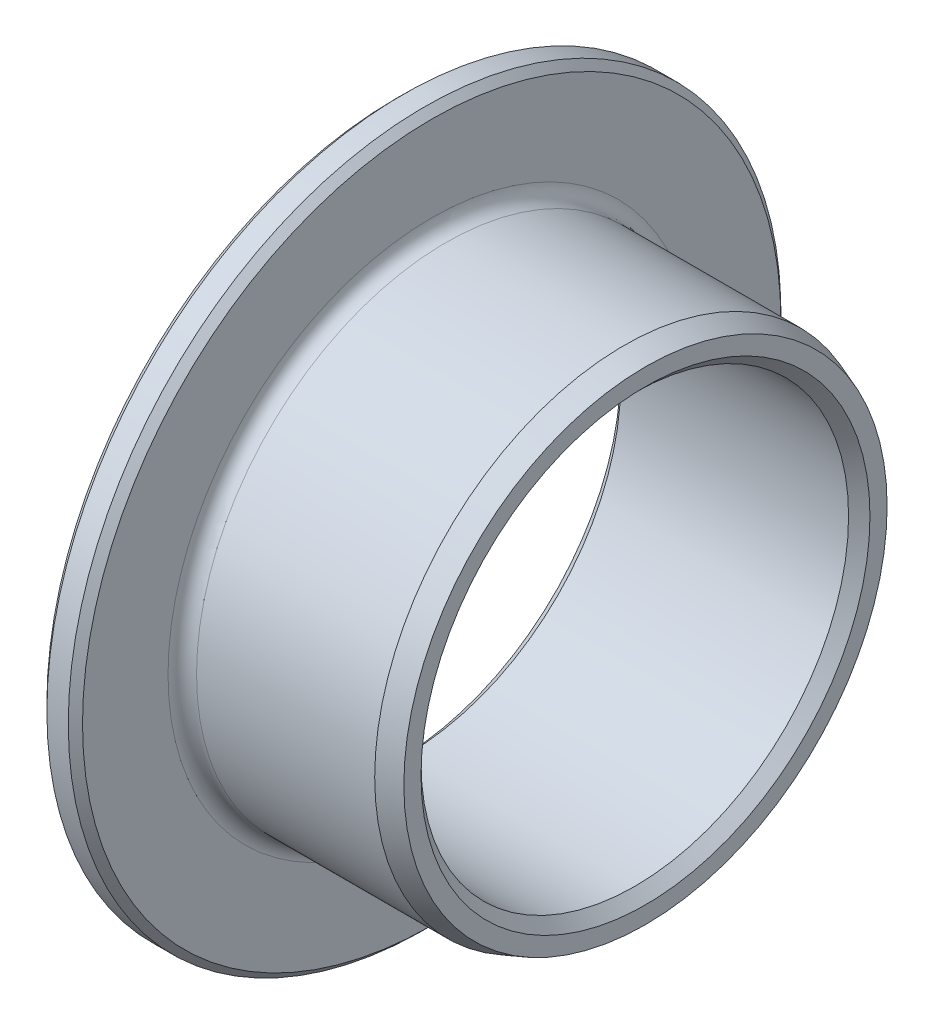
ISO-10303-21;
HEADER;
FILE_DESCRIPTION(('STEP AP214'),'2;1');
FILE_NAME('part.step','',(''),(''),'','','');
FILE_SCHEMA(('AUTOMOTIVE_DESIGN { 1 0 10303 214 1 1 1 1 }'));
ENDSEC;
DATA;
#1=APPLICATION_CONTEXT('core data for automotive mechanical design processes');
#2=APPLICATION_PROTOCOL_DEFINITION('international standard','automotive_design',2000,#1);
#3=PRODUCT_CONTEXT('',#1,'mechanical');
#4=PRODUCT('Part','Part','',(#3));
#5=PRODUCT_RELATED_PRODUCT_CATEGORY('part','',(#4));
#6=PRODUCT_DEFINITION_FORMATION('','',#4);
#7=PRODUCT_DEFINITION_CONTEXT('part definition',#1,'design');
#8=PRODUCT_DEFINITION('design','',#6,#7);
#9=PRODUCT_DEFINITION_SHAPE('','',#8);
#10=(LENGTH_UNIT() NAMED_UNIT(*) SI_UNIT(.MILLI.,.METRE.));
#11=(NAMED_UNIT(*) PLANE_ANGLE_UNIT() SI_UNIT($,.RADIAN.));
#12=(NAMED_UNIT(*) SI_UNIT($,.STERADIAN.) SOLID_ANGLE_UNIT());
#13=UNCERTAINTY_MEASURE_WITH_UNIT(LENGTH_MEASURE(1.E-05),#10,'distance_accuracy_value','');
#14=(GEOMETRIC_REPRESENTATION_CONTEXT(3) GLOBAL_UNCERTAINTY_ASSIGNED_CONTEXT((#13)) GLOBAL_UNIT_ASSIGNED_CONTEXT((#10,
#11,#12)) REPRESENTATION_CONTEXT('',''));
#15=CARTESIAN_POINT('',(0.,0.,0.));
#16=DIRECTION('',(0.,0.,1.));
#17=DIRECTION('',(1.,0.,0.));
#18=AXIS2_PLACEMENT_3D('',#15,#16,#17);
#19=CARTESIAN_POINT('',(0.,10.,0.));
#20=DIRECTION('',(-1.,0.,0.));
#21=DIRECTION('',(0.,0.,1.));
#22=AXIS2_PLACEMENT_3D('',#19,#20,#21);
#23=PLANE('',#22);
#24=CARTESIAN_POINT('',(0.,0.,0.));
#25=DIRECTION('',(-1.,0.,0.));
#26=DIRECTION('',(0.,0.,1.));
#27=AXIS2_PLACEMENT_3D('',#24,#25,#26);
#28=CIRCLE('',#27,7.4);
#29=CARTESIAN_POINT('',(0.,0.,7.4));
#30=VERTEX_POINT('',#29);
#31=EDGE_CURVE('E38',#30,#30,#28,.T.);
#32=ORIENTED_EDGE('',*,*,#31,.T.);
#33=EDGE_LOOP('',(#32));
#34=FACE_BOUND('',#33,.T.);
#35=CARTESIAN_POINT('',(0.,0.,0.));
#36=DIRECTION('',(-1.,0.,0.));
#37=DIRECTION('',(0.,0.,1.));
#38=AXIS2_PLACEMENT_3D('',#35,#36,#37);
#39=CIRCLE('',#38,9.8);
#40=CARTESIAN_POINT('',(0.,0.,9.8));
#41=VERTEX_POINT('',#40);
#42=EDGE_CURVE('E42',#41,#41,#39,.F.);
#43=ORIENTED_EDGE('',*,*,#42,.T.);
#44=EDGE_LOOP('',(#43));
#45=FACE_BOUND('',#44,.T.);
#46=ADVANCED_FACE('F32',(#34,#45),#23,.F.);
#47=CARTESIAN_POINT('',(-5.31268266176283,0.,0.));
#48=DIRECTION('',(-1.,0.,0.));
#49=DIRECTION('',(0.,0.,1.));
#50=AXIS2_PLACEMENT_3D('',#47,#48,#49);
#51=CYLINDRICAL_SURFACE('',#50,7.);
#52=CARTESIAN_POINT('',(0.400000000000002,0.,0.));
#53=DIRECTION('',(-1.,0.,0.));
#54=DIRECTION('',(0.,0.,1.));
#55=AXIS2_PLACEMENT_3D('',#52,#53,#54);
#56=CIRCLE('',#55,7.);
#57=CARTESIAN_POINT('',(0.400000000000002,0.,7.));
#58=VERTEX_POINT('',#57);
#59=EDGE_CURVE('E10',#58,#58,#56,.F.);
#60=ORIENTED_EDGE('',*,*,#59,.T.);
#61=EDGE_LOOP('',(#60));
#62=FACE_BOUND('',#61,.T.);
#63=CARTESIAN_POINT('',(5.4,0.,0.));
#64=DIRECTION('',(-1.,0.,0.));
#65=DIRECTION('',(0.,0.,1.));
#66=AXIS2_PLACEMENT_3D('',#63,#64,#65);
#67=CIRCLE('',#66,7.);
#68=CARTESIAN_POINT('',(5.4,0.,7.));
#69=VERTEX_POINT('',#68);
#70=EDGE_CURVE('E73',#69,#69,#67,.T.);
#71=ORIENTED_EDGE('',*,*,#70,.T.);
#72=EDGE_LOOP('',(#71));
#73=FACE_BOUND('',#72,.T.);
#74=ADVANCED_FACE('F77',(#62,#73),#51,.T.);
#75=CARTESIAN_POINT('',(6.,7.,0.));
#76=DIRECTION('',(-1.,0.,0.));
#77=DIRECTION('',(0.,0.,1.));
#78=AXIS2_PLACEMENT_3D('',#75,#76,#77);
#79=PLANE('',#78);
#80=CARTESIAN_POINT('',(6.,0.,0.));
#81=DIRECTION('',(-1.,0.,0.));
#82=DIRECTION('',(0.,0.,1.));
#83=AXIS2_PLACEMENT_3D('',#80,#81,#82);
#84=CIRCLE('',#83,6.3);
#85=CARTESIAN_POINT('',(6.,0.,6.3));
#86=VERTEX_POINT('',#85);
#87=EDGE_CURVE('E57',#86,#86,#84,.T.);
#88=ORIENTED_EDGE('',*,*,#87,.T.);
#89=EDGE_LOOP('',(#88));
#90=FACE_BOUND('',#89,.T.);
#91=CARTESIAN_POINT('',(6.,0.,0.));
#92=DIRECTION('',(-1.,0.,0.));
#93=DIRECTION('',(0.,0.,1.));
#94=AXIS2_PLACEMENT_3D('',#91,#92,#93);
#95=CIRCLE('',#94,6.78161785944028);
#96=CARTESIAN_POINT('',(6.,0.,6.78161785944028));
#97=VERTEX_POINT('',#96);
#98=EDGE_CURVE('E70',#97,#97,#95,.F.);
#99=ORIENTED_EDGE('',*,*,#98,.T.);
#100=EDGE_LOOP('',(#99));
#101=FACE_BOUND('',#100,.T.);
#102=ADVANCED_FACE('F100',(#90,#101),#79,.F.);
#103=CARTESIAN_POINT('',(-5.31268266176283,0.,0.));
#104=DIRECTION('',(-1.,0.,0.));
#105=DIRECTION('',(0.,0.,1.));
#106=AXIS2_PLACEMENT_3D('',#103,#104,#105);
#107=CYLINDRICAL_SURFACE('',#106,6.);
#108=CARTESIAN_POINT('',(-0.699999999999998,0.,0.));
#109=DIRECTION('',(1.,0.,0.));
#110=DIRECTION('',(0.,0.,-1.));
#111=AXIS2_PLACEMENT_3D('',#108,#109,#110);
#112=CIRCLE('',#111,6.);
#113=CARTESIAN_POINT('',(-0.699999999999998,0.,-6.));
#114=VERTEX_POINT('',#113);
#115=EDGE_CURVE('E64',#114,#114,#112,.F.);
#116=ORIENTED_EDGE('',*,*,#115,.T.);
#117=EDGE_LOOP('',(#116));
#118=FACE_BOUND('',#117,.T.);
#119=CARTESIAN_POINT('',(5.7,0.,0.));
#120=DIRECTION('',(-1.,0.,0.));
#121=DIRECTION('',(0.,0.,1.));
#122=AXIS2_PLACEMENT_3D('',#119,#120,#121);
#123=CIRCLE('',#122,6.);
#124=CARTESIAN_POINT('',(5.7,0.,6.));
#125=VERTEX_POINT('',#124);
#126=EDGE_CURVE('E67',#125,#125,#123,.F.);
#127=ORIENTED_EDGE('',*,*,#126,.T.);
#128=EDGE_LOOP('',(#127));
#129=FACE_BOUND('',#128,.T.);
#130=ADVANCED_FACE('F131',(#118,#129),#107,.F.);
#131=CARTESIAN_POINT('',(-0.999999999999998,6.,0.));
#132=DIRECTION('',(1.,0.,0.));
#133=DIRECTION('',(0.,0.,-1.));
#134=AXIS2_PLACEMENT_3D('',#131,#132,#133);
#135=PLANE('',#134);
#136=CARTESIAN_POINT('',(-0.999999999999998,0.,0.));
#137=DIRECTION('',(1.,0.,0.));
#138=DIRECTION('',(0.,0.,-1.));
#139=AXIS2_PLACEMENT_3D('',#136,#137,#138);
#140=CIRCLE('',#139,9.8);
#141=CARTESIAN_POINT('',(-0.999999999999998,0.,-9.8));
#142=VERTEX_POINT('',#141);
#143=EDGE_CURVE('E54',#142,#142,#140,.F.);
#144=ORIENTED_EDGE('',*,*,#143,.T.);
#145=EDGE_LOOP('',(#144));
#146=FACE_BOUND('',#145,.T.);
#147=CARTESIAN_POINT('',(-0.999999999999998,0.,0.));
#148=DIRECTION('',(1.,0.,0.));
#149=DIRECTION('',(0.,0.,-1.));
#150=AXIS2_PLACEMENT_3D('',#147,#148,#149);
#151=CIRCLE('',#150,6.3);
#152=CARTESIAN_POINT('',(-0.999999999999998,0.,-6.3));
#153=VERTEX_POINT('',#152);
#154=EDGE_CURVE('E60',#153,#153,#151,.T.);
#155=ORIENTED_EDGE('',*,*,#154,.T.);
#156=EDGE_LOOP('',(#155));
#157=FACE_BOUND('',#156,.T.);
#158=ADVANCED_FACE('F92',(#146,#157),#135,.F.);
#159=CARTESIAN_POINT('',(-5.31268266176283,0.,0.));
#160=DIRECTION('',(-1.,0.,0.));
#161=DIRECTION('',(0.,0.,1.));
#162=AXIS2_PLACEMENT_3D('',#159,#160,#161);
#163=CYLINDRICAL_SURFACE('',#162,10.);
#164=CARTESIAN_POINT('',(-0.8,0.,0.));
#165=DIRECTION('',(1.,0.,0.));
#166=DIRECTION('',(0.,0.,-1.));
#167=AXIS2_PLACEMENT_3D('',#164,#165,#166);
#168=CIRCLE('',#167,10.);
#169=CARTESIAN_POINT('',(-0.8,0.,-10.));
#170=VERTEX_POINT('',#169);
#171=EDGE_CURVE('E46',#170,#170,#168,.T.);
#172=ORIENTED_EDGE('',*,*,#171,.T.);
#173=EDGE_LOOP('',(#172));
#174=FACE_BOUND('',#173,.T.);
#175=CARTESIAN_POINT('',(-0.199999999999999,0.,0.));
#176=DIRECTION('',(-1.,0.,0.));
#177=DIRECTION('',(0.,0.,1.));
#178=AXIS2_PLACEMENT_3D('',#175,#176,#177);
#179=CIRCLE('',#178,10.);
#180=CARTESIAN_POINT('',(-0.199999999999999,0.,10.));
#181=VERTEX_POINT('',#180);
#182=EDGE_CURVE('E51',#181,#181,#179,.T.);
#183=ORIENTED_EDGE('',*,*,#182,.T.);
#184=EDGE_LOOP('',(#183));
#185=FACE_BOUND('',#184,.T.);
#186=ADVANCED_FACE('F82',(#174,#185),#163,.T.);
#187=CARTESIAN_POINT('',(5.4,0.,0.));
#188=DIRECTION('',(-1.,0.,0.));
#189=DIRECTION('',(0.,0.,1.));
#190=AXIS2_PLACEMENT_3D('',#187,#188,#189);
#191=CONICAL_SURFACE('',#190,7.,0.349065850398864);
#192=ORIENTED_EDGE('',*,*,#98,.F.);
#193=EDGE_LOOP('',(#192));
#194=FACE_BOUND('',#193,.T.);
#195=ORIENTED_EDGE('',*,*,#70,.F.);
#196=EDGE_LOOP('',(#195));
#197=FACE_BOUND('',#196,.T.);
#198=ADVANCED_FACE('F79',(#194,#197),#191,.T.);
#199=CARTESIAN_POINT('',(-0.699999999999998,0.,0.));
#200=DIRECTION('',(-1.,0.,0.));
#201=DIRECTION('',(0.,0.,1.));
#202=AXIS2_PLACEMENT_3D('',#199,#200,#201);
#203=CONICAL_SURFACE('',#202,6.,0.785398163397451);
#204=ORIENTED_EDGE('',*,*,#154,.F.);
#205=EDGE_LOOP('',(#204));
#206=FACE_BOUND('',#205,.T.);
#207=ORIENTED_EDGE('',*,*,#115,.F.);
#208=EDGE_LOOP('',(#207));
#209=FACE_BOUND('',#208,.T.);
#210=ADVANCED_FACE('F81',(#206,#209),#203,.F.);
#211=CARTESIAN_POINT('',(6.,0.,0.));
#212=DIRECTION('',(1.,0.,0.));
#213=DIRECTION('',(0.,0.,-1.));
#214=AXIS2_PLACEMENT_3D('',#211,#212,#213);
#215=CONICAL_SURFACE('',#214,6.3,0.785398163397448);
#216=ORIENTED_EDGE('',*,*,#126,.F.);
#217=EDGE_LOOP('',(#216));
#218=FACE_BOUND('',#217,.T.);
#219=ORIENTED_EDGE('',*,*,#87,.F.);
#220=EDGE_LOOP('',(#219));
#221=FACE_BOUND('',#220,.T.);
#222=ADVANCED_FACE('F89',(#218,#221),#215,.F.);
#223=CARTESIAN_POINT('',(-0.999999999999998,0.,0.));
#224=DIRECTION('',(1.,0.,0.));
#225=DIRECTION('',(0.,0.,-1.));
#226=AXIS2_PLACEMENT_3D('',#223,#224,#225);
#227=CONICAL_SURFACE('',#226,9.8,0.78539816339745);
#228=ORIENTED_EDGE('',*,*,#171,.F.);
#229=EDGE_LOOP('',(#228));
#230=FACE_BOUND('',#229,.T.);
#231=ORIENTED_EDGE('',*,*,#143,.F.);
#232=EDGE_LOOP('',(#231));
#233=FACE_BOUND('',#232,.T.);
#234=ADVANCED_FACE('F108',(#230,#233),#227,.T.);
#235=CARTESIAN_POINT('',(-0.199999999999999,0.,0.));
#236=DIRECTION('',(-1.,0.,0.));
#237=DIRECTION('',(0.,0.,1.));
#238=AXIS2_PLACEMENT_3D('',#235,#236,#237);
#239=CONICAL_SURFACE('',#238,10.,0.785398163397453);
#240=ORIENTED_EDGE('',*,*,#42,.F.);
#241=EDGE_LOOP('',(#240));
#242=FACE_BOUND('',#241,.T.);
#243=ORIENTED_EDGE('',*,*,#182,.F.);
#244=EDGE_LOOP('',(#243));
#245=FACE_BOUND('',#244,.T.);
#246=ADVANCED_FACE('F104',(#242,#245),#239,.T.);
#247=CARTESIAN_POINT('',(0.400000000000002,0.,0.));
#248=DIRECTION('',(-1.,0.,0.));
#249=DIRECTION('',(0.,0.,1.));
#250=AXIS2_PLACEMENT_3D('',#247,#248,#249);
#251=TOROIDAL_SURFACE('',#250,7.4,0.4);
#252=ORIENTED_EDGE('',*,*,#59,.F.);
#253=EDGE_LOOP('',(#252));
#254=FACE_BOUND('',#253,.T.);
#255=ORIENTED_EDGE('',*,*,#31,.F.);
#256=EDGE_LOOP('',(#255));
#257=FACE_BOUND('',#256,.T.);
#258=ADVANCED_FACE('F107',(#254,#257),#251,.F.);
#259=CLOSED_SHELL('',(#46,#74,#102,#130,#158,#186,#198,#210,#222,#234,#246,#258));
#260=MANIFOLD_SOLID_BREP('B2',#259);
#261=ADVANCED_BREP_SHAPE_REPRESENTATION('',(#18,#260),#14);
#262=SHAPE_DEFINITION_REPRESENTATION(#9,#261);
ENDSEC;
END-ISO-10303-21;
